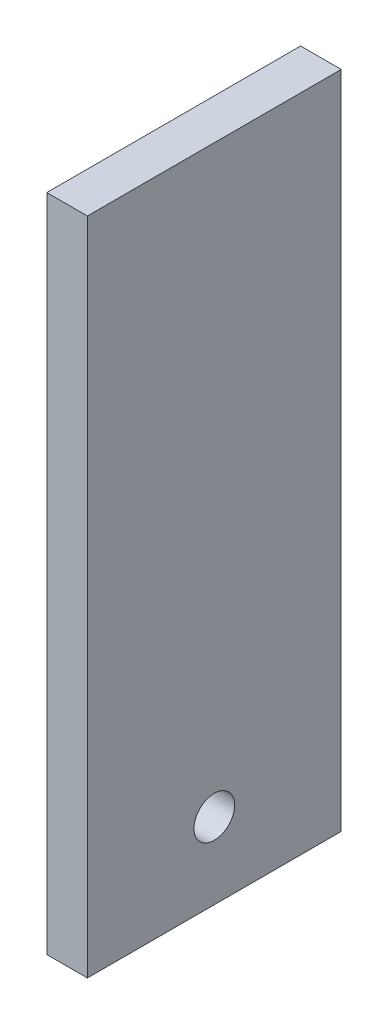
ISO-10303-21;
HEADER;
FILE_DESCRIPTION(('STEP AP214'),'2;1');
FILE_NAME('part.step','',(''),(''),'','','');
FILE_SCHEMA(('AUTOMOTIVE_DESIGN { 1 0 10303 214 1 1 1 1 }'));
ENDSEC;
DATA;
#1=APPLICATION_CONTEXT('core data for automotive mechanical design processes');
#2=APPLICATION_PROTOCOL_DEFINITION('international standard','automotive_design',2000,#1);
#3=PRODUCT_CONTEXT('',#1,'mechanical');
#4=PRODUCT('Part','Part','',(#3));
#5=PRODUCT_RELATED_PRODUCT_CATEGORY('part','',(#4));
#6=PRODUCT_DEFINITION_FORMATION('','',#4);
#7=PRODUCT_DEFINITION_CONTEXT('part definition',#1,'design');
#8=PRODUCT_DEFINITION('design','',#6,#7);
#9=PRODUCT_DEFINITION_SHAPE('','',#8);
#10=(LENGTH_UNIT() NAMED_UNIT(*) SI_UNIT(.MILLI.,.METRE.));
#11=(NAMED_UNIT(*) PLANE_ANGLE_UNIT() SI_UNIT($,.RADIAN.));
#12=(NAMED_UNIT(*) SI_UNIT($,.STERADIAN.) SOLID_ANGLE_UNIT());
#13=UNCERTAINTY_MEASURE_WITH_UNIT(LENGTH_MEASURE(1.E-05),#10,'distance_accuracy_value','');
#14=(GEOMETRIC_REPRESENTATION_CONTEXT(3) GLOBAL_UNCERTAINTY_ASSIGNED_CONTEXT((#13)) GLOBAL_UNIT_ASSIGNED_CONTEXT((#10,
#11,#12)) REPRESENTATION_CONTEXT('',''));
#15=CARTESIAN_POINT('',(0.,0.,0.));
#16=DIRECTION('',(0.,0.,1.));
#17=DIRECTION('',(1.,0.,0.));
#18=AXIS2_PLACEMENT_3D('',#15,#16,#17);
#19=CARTESIAN_POINT('',(8.,0.,0.));
#20=DIRECTION('',(0.,0.,1.));
#21=DIRECTION('',(1.,0.,0.));
#22=AXIS2_PLACEMENT_3D('',#19,#20,#21);
#23=PLANE('',#22);
#24=DIRECTION('',(0.,1.,0.));
#25=VECTOR('',#24,1.);
#26=CARTESIAN_POINT('',(0.,0.,0.));
#27=LINE('',#26,#25);
#28=CARTESIAN_POINT('',(0.,0.,0.));
#29=VERTEX_POINT('',#28);
#30=CARTESIAN_POINT('',(0.,130.,0.));
#31=VERTEX_POINT('',#30);
#32=EDGE_CURVE('E99',#29,#31,#27,.T.);
#33=ORIENTED_EDGE('',*,*,#32,.F.);
#34=DIRECTION('',(-1.,0.,0.));
#35=VECTOR('',#34,1.);
#36=CARTESIAN_POINT('',(8.,0.,0.));
#37=LINE('',#36,#35);
#38=CARTESIAN_POINT('',(8.,0.,0.));
#39=VERTEX_POINT('',#38);
#40=EDGE_CURVE('E11',#39,#29,#37,.T.);
#41=ORIENTED_EDGE('',*,*,#40,.F.);
#42=DIRECTION('',(0.,1.,0.));
#43=VECTOR('',#42,1.);
#44=CARTESIAN_POINT('',(8.,0.,0.));
#45=LINE('',#44,#43);
#46=CARTESIAN_POINT('',(8.,130.,0.));
#47=VERTEX_POINT('',#46);
#48=EDGE_CURVE('E93',#39,#47,#45,.T.);
#49=ORIENTED_EDGE('',*,*,#48,.T.);
#50=DIRECTION('',(-1.,0.,0.));
#51=VECTOR('',#50,1.);
#52=CARTESIAN_POINT('',(8.,130.,0.));
#53=LINE('',#52,#51);
#54=EDGE_CURVE('E36',#47,#31,#53,.T.);
#55=ORIENTED_EDGE('',*,*,#54,.T.);
#56=EDGE_LOOP('',(#33,#41,#49,#55));
#57=FACE_BOUND('',#56,.T.);
#58=ADVANCED_FACE('F33',(#57),#23,.T.);
#59=CARTESIAN_POINT('',(8.,0.,0.));
#60=DIRECTION('',(0.,1.,0.));
#61=DIRECTION('',(0.,0.,1.));
#62=AXIS2_PLACEMENT_3D('',#59,#60,#61);
#63=PLANE('',#62);
#64=DIRECTION('',(0.,0.,-1.));
#65=VECTOR('',#64,1.);
#66=CARTESIAN_POINT('',(0.,0.,0.));
#67=LINE('',#66,#65);
#68=CARTESIAN_POINT('',(0.,0.,-50.));
#69=VERTEX_POINT('',#68);
#70=EDGE_CURVE('E66',#29,#69,#67,.T.);
#71=ORIENTED_EDGE('',*,*,#70,.T.);
#72=DIRECTION('',(-1.,0.,0.));
#73=VECTOR('',#72,1.);
#74=CARTESIAN_POINT('',(8.,0.,-50.));
#75=LINE('',#74,#73);
#76=CARTESIAN_POINT('',(8.,0.,-50.));
#77=VERTEX_POINT('',#76);
#78=EDGE_CURVE('E42',#77,#69,#75,.T.);
#79=ORIENTED_EDGE('',*,*,#78,.F.);
#80=DIRECTION('',(0.,0.,-1.));
#81=VECTOR('',#80,1.);
#82=CARTESIAN_POINT('',(8.,0.,0.));
#83=LINE('',#82,#81);
#84=EDGE_CURVE('E83',#39,#77,#83,.T.);
#85=ORIENTED_EDGE('',*,*,#84,.F.);
#86=ORIENTED_EDGE('',*,*,#40,.T.);
#87=EDGE_LOOP('',(#71,#79,#85,#86));
#88=FACE_BOUND('',#87,.T.);
#89=ADVANCED_FACE('F110',(#88),#63,.F.);
#90=CARTESIAN_POINT('',(8.,0.,-50.));
#91=DIRECTION('',(0.,0.,1.));
#92=DIRECTION('',(1.,0.,0.));
#93=AXIS2_PLACEMENT_3D('',#90,#91,#92);
#94=PLANE('',#93);
#95=DIRECTION('',(0.,1.,0.));
#96=VECTOR('',#95,1.);
#97=CARTESIAN_POINT('',(0.,0.,-50.));
#98=LINE('',#97,#96);
#99=CARTESIAN_POINT('',(0.,130.,-50.));
#100=VERTEX_POINT('',#99);
#101=EDGE_CURVE('E90',#69,#100,#98,.T.);
#102=ORIENTED_EDGE('',*,*,#101,.T.);
#103=DIRECTION('',(-1.,0.,0.));
#104=VECTOR('',#103,1.);
#105=CARTESIAN_POINT('',(8.,130.,-50.));
#106=LINE('',#105,#104);
#107=CARTESIAN_POINT('',(8.,130.,-50.));
#108=VERTEX_POINT('',#107);
#109=EDGE_CURVE('E87',#108,#100,#106,.T.);
#110=ORIENTED_EDGE('',*,*,#109,.F.);
#111=DIRECTION('',(0.,1.,0.));
#112=VECTOR('',#111,1.);
#113=CARTESIAN_POINT('',(8.,0.,-50.));
#114=LINE('',#113,#112);
#115=EDGE_CURVE('E78',#77,#108,#114,.T.);
#116=ORIENTED_EDGE('',*,*,#115,.F.);
#117=ORIENTED_EDGE('',*,*,#78,.T.);
#118=EDGE_LOOP('',(#102,#110,#116,#117));
#119=FACE_BOUND('',#118,.T.);
#120=ADVANCED_FACE('F88',(#119),#94,.F.);
#121=CARTESIAN_POINT('',(8.,130.,0.));
#122=DIRECTION('',(0.,1.,0.));
#123=DIRECTION('',(0.,0.,1.));
#124=AXIS2_PLACEMENT_3D('',#121,#122,#123);
#125=PLANE('',#124);
#126=DIRECTION('',(0.,0.,-1.));
#127=VECTOR('',#126,1.);
#128=CARTESIAN_POINT('',(0.,130.,0.));
#129=LINE('',#128,#127);
#130=EDGE_CURVE('E102',#31,#100,#129,.T.);
#131=ORIENTED_EDGE('',*,*,#130,.F.);
#132=ORIENTED_EDGE('',*,*,#54,.F.);
#133=DIRECTION('',(0.,0.,-1.));
#134=VECTOR('',#133,1.);
#135=CARTESIAN_POINT('',(8.,130.,0.));
#136=LINE('',#135,#134);
#137=EDGE_CURVE('E82',#47,#108,#136,.T.);
#138=ORIENTED_EDGE('',*,*,#137,.T.);
#139=ORIENTED_EDGE('',*,*,#109,.T.);
#140=EDGE_LOOP('',(#131,#132,#138,#139));
#141=FACE_BOUND('',#140,.T.);
#142=ADVANCED_FACE('F92',(#141),#125,.T.);
#143=CARTESIAN_POINT('',(8.,0.,0.));
#144=DIRECTION('',(-1.,0.,0.));
#145=DIRECTION('',(0.,0.,1.));
#146=AXIS2_PLACEMENT_3D('',#143,#144,#145);
#147=PLANE('',#146);
#148=CARTESIAN_POINT('',(8.,15.,-25.));
#149=DIRECTION('',(-1.,0.,0.));
#150=DIRECTION('',(0.,0.,1.));
#151=AXIS2_PLACEMENT_3D('',#148,#149,#150);
#152=CIRCLE('',#151,4.);
#153=CARTESIAN_POINT('',(8.,15.,-21.));
#154=VERTEX_POINT('',#153);
#155=EDGE_CURVE('E103',#154,#154,#152,.T.);
#156=ORIENTED_EDGE('',*,*,#155,.T.);
#157=EDGE_LOOP('',(#156));
#158=FACE_BOUND('',#157,.T.);
#159=ORIENTED_EDGE('',*,*,#48,.F.);
#160=ORIENTED_EDGE('',*,*,#84,.T.);
#161=ORIENTED_EDGE('',*,*,#115,.T.);
#162=ORIENTED_EDGE('',*,*,#137,.F.);
#163=EDGE_LOOP('',(#159,#160,#161,#162));
#164=FACE_BOUND('',#163,.T.);
#165=ADVANCED_FACE('F81',(#158,#164),#147,.F.);
#166=CARTESIAN_POINT('',(0.,0.,0.));
#167=DIRECTION('',(-1.,0.,0.));
#168=DIRECTION('',(0.,0.,1.));
#169=AXIS2_PLACEMENT_3D('',#166,#167,#168);
#170=PLANE('',#169);
#171=CARTESIAN_POINT('',(0.,15.,-25.));
#172=DIRECTION('',(1.,0.,0.));
#173=DIRECTION('',(0.,0.,-1.));
#174=AXIS2_PLACEMENT_3D('',#171,#172,#173);
#175=CIRCLE('',#174,4.);
#176=CARTESIAN_POINT('',(0.,15.,-29.));
#177=VERTEX_POINT('',#176);
#178=EDGE_CURVE('E141',#177,#177,#175,.T.);
#179=ORIENTED_EDGE('',*,*,#178,.T.);
#180=EDGE_LOOP('',(#179));
#181=FACE_BOUND('',#180,.T.);
#182=ORIENTED_EDGE('',*,*,#32,.T.);
#183=ORIENTED_EDGE('',*,*,#130,.T.);
#184=ORIENTED_EDGE('',*,*,#101,.F.);
#185=ORIENTED_EDGE('',*,*,#70,.F.);
#186=EDGE_LOOP('',(#182,#183,#184,#185));
#187=FACE_BOUND('',#186,.T.);
#188=ADVANCED_FACE('F108',(#181,#187),#170,.T.);
#189=CARTESIAN_POINT('',(19.3137084989848,15.,-25.));
#190=DIRECTION('',(-1.,0.,0.));
#191=DIRECTION('',(0.,0.,1.));
#192=AXIS2_PLACEMENT_3D('',#189,#190,#191);
#193=CYLINDRICAL_SURFACE('',#192,4.);
#194=ORIENTED_EDGE('',*,*,#155,.F.);
#195=EDGE_LOOP('',(#194));
#196=FACE_BOUND('',#195,.T.);
#197=ORIENTED_EDGE('',*,*,#178,.F.);
#198=EDGE_LOOP('',(#197));
#199=FACE_BOUND('',#198,.T.);
#200=ADVANCED_FACE('F129',(#196,#199),#193,.F.);
#201=CLOSED_SHELL('',(#58,#89,#120,#142,#165,#188,#200));
#202=MANIFOLD_SOLID_BREP('B2',#201);
#203=ADVANCED_BREP_SHAPE_REPRESENTATION('',(#18,#202),#14);
#204=SHAPE_DEFINITION_REPRESENTATION(#9,#203);
ENDSEC;
END-ISO-10303-21;
